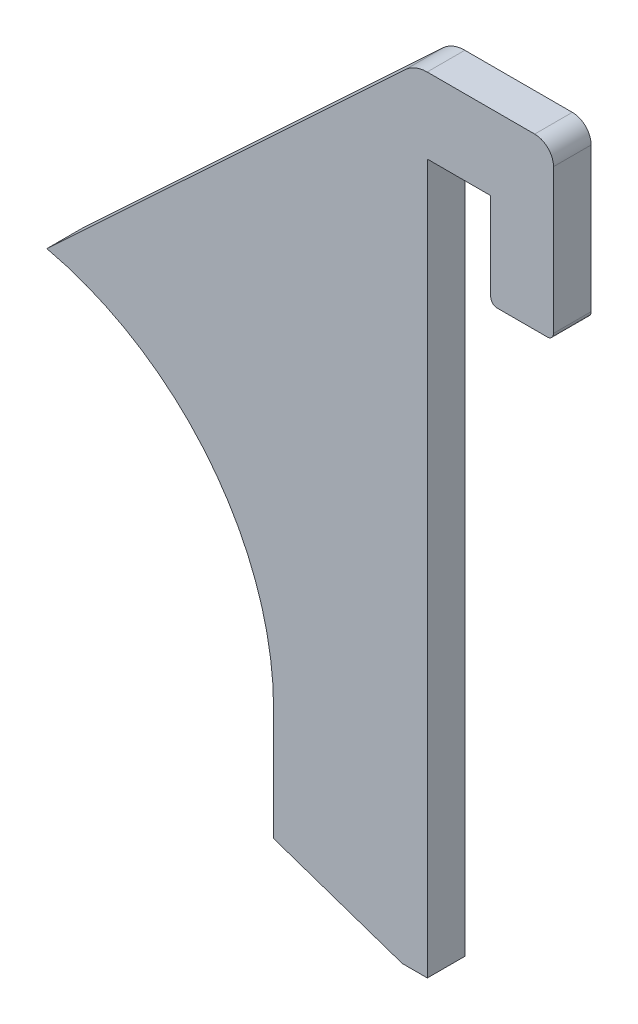
ISO-10303-21;
HEADER;
FILE_DESCRIPTION(('STEP AP214'),'2;1');
FILE_NAME('part.step','',(''),(''),'','','');
FILE_SCHEMA(('AUTOMOTIVE_DESIGN { 1 0 10303 214 1 1 1 1 }'));
ENDSEC;
DATA;
#1=APPLICATION_CONTEXT('core data for automotive mechanical design processes');
#2=APPLICATION_PROTOCOL_DEFINITION('international standard','automotive_design',2000,#1);
#3=PRODUCT_CONTEXT('',#1,'mechanical');
#4=PRODUCT('Part','Part','',(#3));
#5=PRODUCT_RELATED_PRODUCT_CATEGORY('part','',(#4));
#6=PRODUCT_DEFINITION_FORMATION('','',#4);
#7=PRODUCT_DEFINITION_CONTEXT('part definition',#1,'design');
#8=PRODUCT_DEFINITION('design','',#6,#7);
#9=PRODUCT_DEFINITION_SHAPE('','',#8);
#10=(LENGTH_UNIT() NAMED_UNIT(*) SI_UNIT(.MILLI.,.METRE.));
#11=(NAMED_UNIT(*) PLANE_ANGLE_UNIT() SI_UNIT($,.RADIAN.));
#12=(NAMED_UNIT(*) SI_UNIT($,.STERADIAN.) SOLID_ANGLE_UNIT());
#13=UNCERTAINTY_MEASURE_WITH_UNIT(LENGTH_MEASURE(1.E-05),#10,'distance_accuracy_value','');
#14=(GEOMETRIC_REPRESENTATION_CONTEXT(3) GLOBAL_UNCERTAINTY_ASSIGNED_CONTEXT((#13)) GLOBAL_UNIT_ASSIGNED_CONTEXT((#10,
#11,#12)) REPRESENTATION_CONTEXT('',''));
#15=CARTESIAN_POINT('',(0.,0.,0.));
#16=DIRECTION('',(0.,0.,1.));
#17=DIRECTION('',(1.,0.,0.));
#18=AXIS2_PLACEMENT_3D('',#15,#16,#17);
#19=CARTESIAN_POINT('',(69.,100.,6.));
#20=DIRECTION('',(0.681998360062503,-0.731353701619167,0.));
#21=DIRECTION('',(0.731353701619167,0.681998360062503,0.));
#22=AXIS2_PLACEMENT_3D('',#19,#20,#21);
#23=PLANE('',#22);
#24=DIRECTION('',(-0.731353701619167,-0.681998360062503,0.));
#25=VECTOR('',#24,1.);
#26=CARTESIAN_POINT('',(69.,100.,6.));
#27=LINE('',#26,#25);
#28=CARTESIAN_POINT('',(67.5595605777622,98.6567685080958,6.));
#29=VERTEX_POINT('',#28);
#30=CARTESIAN_POINT('',(10.3719829262458,45.3284896083872,6.));
#31=VERTEX_POINT('',#30);
#32=EDGE_CURVE('E143',#29,#31,#27,.T.);
#33=ORIENTED_EDGE('',*,*,#32,.F.);
#34=DIRECTION('',(0.,0.,-1.));
#35=VECTOR('',#34,1.);
#36=CARTESIAN_POINT('',(67.5595605777622,98.6567685080958,6.));
#37=LINE('',#36,#35);
#38=CARTESIAN_POINT('',(67.5595605777622,98.6567685080958,0.));
#39=VERTEX_POINT('',#38);
#40=EDGE_CURVE('E12',#29,#39,#37,.T.);
#41=ORIENTED_EDGE('',*,*,#40,.T.);
#42=DIRECTION('',(-0.731353701619167,-0.681998360062503,0.));
#43=VECTOR('',#42,1.);
#44=CARTESIAN_POINT('',(69.,100.,0.));
#45=LINE('',#44,#43);
#46=CARTESIAN_POINT('',(10.3719829262458,45.3284896083872,0.));
#47=VERTEX_POINT('',#46);
#48=EDGE_CURVE('E166',#39,#47,#45,.T.);
#49=ORIENTED_EDGE('',*,*,#48,.T.);
#50=DIRECTION('',(0.,0.,-1.));
#51=VECTOR('',#50,1.);
#52=CARTESIAN_POINT('',(10.3719829262458,45.3284896083872,6.));
#53=LINE('',#52,#51);
#54=EDGE_CURVE('E159',#31,#47,#53,.T.);
#55=ORIENTED_EDGE('',*,*,#54,.F.);
#56=EDGE_LOOP('',(#33,#41,#49,#55));
#57=FACE_BOUND('',#56,.T.);
#58=ADVANCED_FACE('F36',(#57),#23,.F.);
#59=CARTESIAN_POINT('',(0.,0.,6.));
#60=DIRECTION('',(0.,0.,-1.));
#61=DIRECTION('',(-1.,0.,0.));
#62=AXIS2_PLACEMENT_3D('',#59,#60,#61);
#63=CYLINDRICAL_SURFACE('',#62,46.5);
#64=CARTESIAN_POINT('',(0.,0.,0.));
#65=DIRECTION('',(0.,0.,-1.));
#66=DIRECTION('',(-1.,0.,0.));
#67=AXIS2_PLACEMENT_3D('',#64,#65,#66);
#68=CIRCLE('',#67,46.5);
#69=CARTESIAN_POINT('',(46.5,0.,0.));
#70=VERTEX_POINT('',#69);
#71=EDGE_CURVE('E245',#47,#70,#68,.T.);
#72=ORIENTED_EDGE('',*,*,#71,.T.);
#73=DIRECTION('',(0.,0.,-1.));
#74=VECTOR('',#73,1.);
#75=CARTESIAN_POINT('',(46.5,0.,6.));
#76=LINE('',#75,#74);
#77=CARTESIAN_POINT('',(46.5,0.,6.));
#78=VERTEX_POINT('',#77);
#79=EDGE_CURVE('E161',#78,#70,#76,.T.);
#80=ORIENTED_EDGE('',*,*,#79,.F.);
#81=CARTESIAN_POINT('',(0.,0.,6.));
#82=DIRECTION('',(0.,0.,-1.));
#83=DIRECTION('',(-1.,0.,0.));
#84=AXIS2_PLACEMENT_3D('',#81,#82,#83);
#85=CIRCLE('',#84,46.5);
#86=EDGE_CURVE('E147',#31,#78,#85,.T.);
#87=ORIENTED_EDGE('',*,*,#86,.F.);
#88=ORIENTED_EDGE('',*,*,#54,.T.);
#89=EDGE_LOOP('',(#72,#80,#87,#88));
#90=FACE_BOUND('',#89,.T.);
#91=ADVANCED_FACE('F158',(#90),#63,.F.);
#92=CARTESIAN_POINT('',(46.5,0.,6.));
#93=DIRECTION('',(1.,0.,0.));
#94=DIRECTION('',(0.,1.,0.));
#95=AXIS2_PLACEMENT_3D('',#92,#93,#94);
#96=PLANE('',#95);
#97=DIRECTION('',(0.,-1.,0.));
#98=VECTOR('',#97,1.);
#99=CARTESIAN_POINT('',(46.5,0.,0.));
#100=LINE('',#99,#98);
#101=CARTESIAN_POINT('',(46.5,-18.,0.));
#102=VERTEX_POINT('',#101);
#103=EDGE_CURVE('E239',#70,#102,#100,.T.);
#104=ORIENTED_EDGE('',*,*,#103,.T.);
#105=DIRECTION('',(0.,0.,-1.));
#106=VECTOR('',#105,1.);
#107=CARTESIAN_POINT('',(46.5,-18.,6.));
#108=LINE('',#107,#106);
#109=CARTESIAN_POINT('',(46.5,-18.,6.));
#110=VERTEX_POINT('',#109);
#111=EDGE_CURVE('E172',#110,#102,#108,.T.);
#112=ORIENTED_EDGE('',*,*,#111,.F.);
#113=DIRECTION('',(0.,-1.,0.));
#114=VECTOR('',#113,1.);
#115=CARTESIAN_POINT('',(46.5,0.,6.));
#116=LINE('',#115,#114);
#117=EDGE_CURVE('E163',#78,#110,#116,.T.);
#118=ORIENTED_EDGE('',*,*,#117,.F.);
#119=ORIENTED_EDGE('',*,*,#79,.T.);
#120=EDGE_LOOP('',(#104,#112,#118,#119));
#121=FACE_BOUND('',#120,.T.);
#122=ADVANCED_FACE('F277',(#121),#96,.F.);
#123=CARTESIAN_POINT('',(46.5,-18.,6.));
#124=DIRECTION('',(0.323143853291512,0.946349856067994,0.));
#125=DIRECTION('',(-0.946349856067995,0.323143853291512,0.));
#126=AXIS2_PLACEMENT_3D('',#123,#124,#125);
#127=PLANE('',#126);
#128=DIRECTION('',(0.946349856067994,-0.323143853291512,0.));
#129=VECTOR('',#128,1.);
#130=CARTESIAN_POINT('',(46.5,-18.,0.));
#131=LINE('',#130,#129);
#132=CARTESIAN_POINT('',(67.,-25.,0.));
#133=VERTEX_POINT('',#132);
#134=EDGE_CURVE('E234',#102,#133,#131,.T.);
#135=ORIENTED_EDGE('',*,*,#134,.T.);
#136=DIRECTION('',(0.,0.,-1.));
#137=VECTOR('',#136,1.);
#138=CARTESIAN_POINT('',(67.,-25.,6.));
#139=LINE('',#138,#137);
#140=CARTESIAN_POINT('',(67.,-25.,6.));
#141=VERTEX_POINT('',#140);
#142=EDGE_CURVE('E225',#141,#133,#139,.T.);
#143=ORIENTED_EDGE('',*,*,#142,.F.);
#144=DIRECTION('',(0.946349856067994,-0.323143853291512,0.));
#145=VECTOR('',#144,1.);
#146=CARTESIAN_POINT('',(46.5,-18.,6.));
#147=LINE('',#146,#145);
#148=EDGE_CURVE('E235',#110,#141,#147,.T.);
#149=ORIENTED_EDGE('',*,*,#148,.F.);
#150=ORIENTED_EDGE('',*,*,#111,.T.);
#151=EDGE_LOOP('',(#135,#143,#149,#150));
#152=FACE_BOUND('',#151,.T.);
#153=ADVANCED_FACE('F232',(#152),#127,.F.);
#154=CARTESIAN_POINT('',(67.,-25.,6.));
#155=DIRECTION('',(0.,1.,0.));
#156=DIRECTION('',(-1.,0.,0.));
#157=AXIS2_PLACEMENT_3D('',#154,#155,#156);
#158=PLANE('',#157);
#159=DIRECTION('',(1.,0.,0.));
#160=VECTOR('',#159,1.);
#161=CARTESIAN_POINT('',(67.,-25.,0.));
#162=LINE('',#161,#160);
#163=CARTESIAN_POINT('',(71.,-25.,0.));
#164=VERTEX_POINT('',#163);
#165=EDGE_CURVE('E241',#133,#164,#162,.T.);
#166=ORIENTED_EDGE('',*,*,#165,.T.);
#167=DIRECTION('',(0.,0.,-1.));
#168=VECTOR('',#167,1.);
#169=CARTESIAN_POINT('',(71.,-25.,6.));
#170=LINE('',#169,#168);
#171=CARTESIAN_POINT('',(71.,-25.,6.));
#172=VERTEX_POINT('',#171);
#173=EDGE_CURVE('E222',#172,#164,#170,.T.);
#174=ORIENTED_EDGE('',*,*,#173,.F.);
#175=DIRECTION('',(1.,0.,0.));
#176=VECTOR('',#175,1.);
#177=CARTESIAN_POINT('',(67.,-25.,6.));
#178=LINE('',#177,#176);
#179=EDGE_CURVE('E279',#141,#172,#178,.T.);
#180=ORIENTED_EDGE('',*,*,#179,.F.);
#181=ORIENTED_EDGE('',*,*,#142,.T.);
#182=EDGE_LOOP('',(#166,#174,#180,#181));
#183=FACE_BOUND('',#182,.T.);
#184=ADVANCED_FACE('F306',(#183),#158,.F.);
#185=CARTESIAN_POINT('',(71.,-25.,6.));
#186=DIRECTION('',(-1.,0.,0.));
#187=DIRECTION('',(0.,0.,1.));
#188=AXIS2_PLACEMENT_3D('',#185,#186,#187);
#189=PLANE('',#188);
#190=DIRECTION('',(0.,1.,0.));
#191=VECTOR('',#190,1.);
#192=CARTESIAN_POINT('',(71.,-25.,0.));
#193=LINE('',#192,#191);
#194=CARTESIAN_POINT('',(71.,88.,0.));
#195=VERTEX_POINT('',#194);
#196=EDGE_CURVE('E243',#164,#195,#193,.T.);
#197=ORIENTED_EDGE('',*,*,#196,.T.);
#198=DIRECTION('',(0.,0.,-1.));
#199=VECTOR('',#198,1.);
#200=CARTESIAN_POINT('',(71.,88.,6.));
#201=LINE('',#200,#199);
#202=CARTESIAN_POINT('',(71.,88.,6.));
#203=VERTEX_POINT('',#202);
#204=EDGE_CURVE('E219',#203,#195,#201,.T.);
#205=ORIENTED_EDGE('',*,*,#204,.F.);
#206=DIRECTION('',(0.,1.,0.));
#207=VECTOR('',#206,1.);
#208=CARTESIAN_POINT('',(71.,-25.,6.));
#209=LINE('',#208,#207);
#210=EDGE_CURVE('E283',#172,#203,#209,.T.);
#211=ORIENTED_EDGE('',*,*,#210,.F.);
#212=ORIENTED_EDGE('',*,*,#173,.T.);
#213=EDGE_LOOP('',(#197,#205,#211,#212));
#214=FACE_BOUND('',#213,.T.);
#215=ADVANCED_FACE('F301',(#214),#189,.F.);
#216=CARTESIAN_POINT('',(71.,88.,6.));
#217=DIRECTION('',(0.,1.,0.));
#218=DIRECTION('',(0.,0.,1.));
#219=AXIS2_PLACEMENT_3D('',#216,#217,#218);
#220=PLANE('',#219);
#221=DIRECTION('',(1.,0.,0.));
#222=VECTOR('',#221,1.);
#223=CARTESIAN_POINT('',(71.,88.,0.));
#224=LINE('',#223,#222);
#225=CARTESIAN_POINT('',(81.1,88.,0.));
#226=VERTEX_POINT('',#225);
#227=EDGE_CURVE('E250',#195,#226,#224,.T.);
#228=ORIENTED_EDGE('',*,*,#227,.T.);
#229=DIRECTION('',(0.,0.,-1.));
#230=VECTOR('',#229,1.);
#231=CARTESIAN_POINT('',(81.1,88.,6.));
#232=LINE('',#231,#230);
#233=CARTESIAN_POINT('',(81.1,88.,6.));
#234=VERTEX_POINT('',#233);
#235=EDGE_CURVE('E216',#234,#226,#232,.T.);
#236=ORIENTED_EDGE('',*,*,#235,.F.);
#237=DIRECTION('',(1.,0.,0.));
#238=VECTOR('',#237,1.);
#239=CARTESIAN_POINT('',(71.,88.,6.));
#240=LINE('',#239,#238);
#241=EDGE_CURVE('E285',#203,#234,#240,.T.);
#242=ORIENTED_EDGE('',*,*,#241,.F.);
#243=ORIENTED_EDGE('',*,*,#204,.T.);
#244=EDGE_LOOP('',(#228,#236,#242,#243));
#245=FACE_BOUND('',#244,.T.);
#246=ADVANCED_FACE('F298',(#245),#220,.F.);
#247=CARTESIAN_POINT('',(81.1,88.,6.));
#248=DIRECTION('',(1.,0.,0.));
#249=DIRECTION('',(0.,0.,-1.));
#250=AXIS2_PLACEMENT_3D('',#247,#248,#249);
#251=PLANE('',#250);
#252=DIRECTION('',(0.,-1.,0.));
#253=VECTOR('',#252,1.);
#254=CARTESIAN_POINT('',(81.1,88.,0.));
#255=LINE('',#254,#253);
#256=CARTESIAN_POINT('',(81.1,74.,0.));
#257=VERTEX_POINT('',#256);
#258=EDGE_CURVE('E252',#226,#257,#255,.T.);
#259=ORIENTED_EDGE('',*,*,#258,.T.);
#260=DIRECTION('',(0.,0.,-1.));
#261=VECTOR('',#260,1.);
#262=CARTESIAN_POINT('',(81.1,74.,6.));
#263=LINE('',#262,#261);
#264=CARTESIAN_POINT('',(81.1,74.,6.));
#265=VERTEX_POINT('',#264);
#266=EDGE_CURVE('E186',#257,#265,#263,.F.);
#267=ORIENTED_EDGE('',*,*,#266,.T.);
#268=DIRECTION('',(0.,-1.,0.));
#269=VECTOR('',#268,1.);
#270=CARTESIAN_POINT('',(81.1,88.,6.));
#271=LINE('',#270,#269);
#272=EDGE_CURVE('E273',#234,#265,#271,.T.);
#273=ORIENTED_EDGE('',*,*,#272,.F.);
#274=ORIENTED_EDGE('',*,*,#235,.T.);
#275=EDGE_LOOP('',(#259,#267,#273,#274));
#276=FACE_BOUND('',#275,.T.);
#277=ADVANCED_FACE('F296',(#276),#251,.F.);
#278=CARTESIAN_POINT('',(81.1,73.,6.));
#279=DIRECTION('',(0.,1.,0.));
#280=DIRECTION('',(-1.,0.,0.));
#281=AXIS2_PLACEMENT_3D('',#278,#279,#280);
#282=PLANE('',#281);
#283=DIRECTION('',(1.,0.,0.));
#284=VECTOR('',#283,1.);
#285=CARTESIAN_POINT('',(81.1,73.,6.));
#286=LINE('',#285,#284);
#287=CARTESIAN_POINT('',(82.1,73.,6.));
#288=VERTEX_POINT('',#287);
#289=CARTESIAN_POINT('',(90.1,73.,6.));
#290=VERTEX_POINT('',#289);
#291=EDGE_CURVE('E267',#288,#290,#286,.T.);
#292=ORIENTED_EDGE('',*,*,#291,.F.);
#293=DIRECTION('',(0.,0.,-1.));
#294=VECTOR('',#293,1.);
#295=CARTESIAN_POINT('',(82.1,73.,6.));
#296=LINE('',#295,#294);
#297=CARTESIAN_POINT('',(82.1,73.,0.));
#298=VERTEX_POINT('',#297);
#299=EDGE_CURVE('E170',#288,#298,#296,.T.);
#300=ORIENTED_EDGE('',*,*,#299,.T.);
#301=DIRECTION('',(1.,0.,0.));
#302=VECTOR('',#301,1.);
#303=CARTESIAN_POINT('',(81.1,73.,0.));
#304=LINE('',#303,#302);
#305=CARTESIAN_POINT('',(90.1,73.,0.));
#306=VERTEX_POINT('',#305);
#307=EDGE_CURVE('E212',#298,#306,#304,.T.);
#308=ORIENTED_EDGE('',*,*,#307,.T.);
#309=DIRECTION('',(0.,0.,-1.));
#310=VECTOR('',#309,1.);
#311=CARTESIAN_POINT('',(90.1,73.,6.));
#312=LINE('',#311,#310);
#313=EDGE_CURVE('E168',#306,#290,#312,.F.);
#314=ORIENTED_EDGE('',*,*,#313,.T.);
#315=EDGE_LOOP('',(#292,#300,#308,#314));
#316=FACE_BOUND('',#315,.T.);
#317=ADVANCED_FACE('F258',(#316),#282,.F.);
#318=CARTESIAN_POINT('',(91.1,73.,6.));
#319=DIRECTION('',(-1.,0.,0.));
#320=DIRECTION('',(0.,0.,1.));
#321=AXIS2_PLACEMENT_3D('',#318,#319,#320);
#322=PLANE('',#321);
#323=DIRECTION('',(0.,1.,0.));
#324=VECTOR('',#323,1.);
#325=CARTESIAN_POINT('',(91.1,73.,6.));
#326=LINE('',#325,#324);
#327=CARTESIAN_POINT('',(91.1,74.,6.));
#328=VERTEX_POINT('',#327);
#329=CARTESIAN_POINT('',(91.1,97.,6.));
#330=VERTEX_POINT('',#329);
#331=EDGE_CURVE('E266',#328,#330,#326,.T.);
#332=ORIENTED_EDGE('',*,*,#331,.F.);
#333=DIRECTION('',(0.,0.,-1.));
#334=VECTOR('',#333,1.);
#335=CARTESIAN_POINT('',(91.1,74.,6.));
#336=LINE('',#335,#334);
#337=CARTESIAN_POINT('',(91.1,74.,0.));
#338=VERTEX_POINT('',#337);
#339=EDGE_CURVE('E196',#328,#338,#336,.T.);
#340=ORIENTED_EDGE('',*,*,#339,.T.);
#341=DIRECTION('',(0.,1.,0.));
#342=VECTOR('',#341,1.);
#343=CARTESIAN_POINT('',(91.1,73.,0.));
#344=LINE('',#343,#342);
#345=CARTESIAN_POINT('',(91.1,97.,0.));
#346=VERTEX_POINT('',#345);
#347=EDGE_CURVE('E210',#338,#346,#344,.T.);
#348=ORIENTED_EDGE('',*,*,#347,.T.);
#349=DIRECTION('',(0.,0.,-1.));
#350=VECTOR('',#349,1.);
#351=CARTESIAN_POINT('',(91.1,97.,6.));
#352=LINE('',#351,#350);
#353=EDGE_CURVE('E194',#346,#330,#352,.F.);
#354=ORIENTED_EDGE('',*,*,#353,.T.);
#355=EDGE_LOOP('',(#332,#340,#348,#354));
#356=FACE_BOUND('',#355,.T.);
#357=ADVANCED_FACE('F269',(#356),#322,.F.);
#358=CARTESIAN_POINT('',(91.1,100.,6.));
#359=DIRECTION('',(0.,-1.,0.));
#360=DIRECTION('',(1.,0.,0.));
#361=AXIS2_PLACEMENT_3D('',#358,#359,#360);
#362=PLANE('',#361);
#363=DIRECTION('',(-1.,0.,0.));
#364=VECTOR('',#363,1.);
#365=CARTESIAN_POINT('',(91.1,100.,6.));
#366=LINE('',#365,#364);
#367=CARTESIAN_POINT('',(88.1,100.,6.));
#368=VERTEX_POINT('',#367);
#369=CARTESIAN_POINT('',(70.9695523780747,100.,6.));
#370=VERTEX_POINT('',#369);
#371=EDGE_CURVE('E203',#368,#370,#366,.T.);
#372=ORIENTED_EDGE('',*,*,#371,.F.);
#373=DIRECTION('',(0.,0.,-1.));
#374=VECTOR('',#373,1.);
#375=CARTESIAN_POINT('',(88.1,100.,6.));
#376=LINE('',#375,#374);
#377=CARTESIAN_POINT('',(88.1,100.,0.));
#378=VERTEX_POINT('',#377);
#379=EDGE_CURVE('E44',#368,#378,#376,.T.);
#380=ORIENTED_EDGE('',*,*,#379,.T.);
#381=DIRECTION('',(-1.,0.,0.));
#382=VECTOR('',#381,1.);
#383=CARTESIAN_POINT('',(91.1,100.,0.));
#384=LINE('',#383,#382);
#385=CARTESIAN_POINT('',(70.9695523780747,100.,0.));
#386=VERTEX_POINT('',#385);
#387=EDGE_CURVE('E154',#378,#386,#384,.T.);
#388=ORIENTED_EDGE('',*,*,#387,.T.);
#389=DIRECTION('',(0.,0.,-1.));
#390=VECTOR('',#389,1.);
#391=CARTESIAN_POINT('',(70.9695523780747,100.,6.));
#392=LINE('',#391,#390);
#393=EDGE_CURVE('E51',#386,#370,#392,.F.);
#394=ORIENTED_EDGE('',*,*,#393,.T.);
#395=EDGE_LOOP('',(#372,#380,#388,#394));
#396=FACE_BOUND('',#395,.T.);
#397=ADVANCED_FACE('F202',(#396),#362,.F.);
#398=CARTESIAN_POINT('',(0.,0.,6.));
#399=DIRECTION('',(0.,0.,-1.));
#400=DIRECTION('',(-1.,0.,0.));
#401=AXIS2_PLACEMENT_3D('',#398,#399,#400);
#402=PLANE('',#401);
#403=ORIENTED_EDGE('',*,*,#272,.T.);
#404=CARTESIAN_POINT('',(82.1,74.,6.));
#405=DIRECTION('',(0.,0.,-1.));
#406=DIRECTION('',(-1.,0.,0.));
#407=AXIS2_PLACEMENT_3D('',#404,#405,#406);
#408=CIRCLE('',#407,1.);
#409=EDGE_CURVE('E192',#265,#288,#408,.F.);
#410=ORIENTED_EDGE('',*,*,#409,.T.);
#411=ORIENTED_EDGE('',*,*,#291,.T.);
#412=CARTESIAN_POINT('',(90.1,74.,6.));
#413=DIRECTION('',(0.,0.,-1.));
#414=DIRECTION('',(-1.,0.,0.));
#415=AXIS2_PLACEMENT_3D('',#412,#413,#414);
#416=CIRCLE('',#415,1.);
#417=EDGE_CURVE('E190',#290,#328,#416,.F.);
#418=ORIENTED_EDGE('',*,*,#417,.T.);
#419=ORIENTED_EDGE('',*,*,#331,.T.);
#420=CARTESIAN_POINT('',(88.1,97.,6.));
#421=DIRECTION('',(0.,0.,-1.));
#422=DIRECTION('',(-1.,0.,0.));
#423=AXIS2_PLACEMENT_3D('',#420,#421,#422);
#424=CIRCLE('',#423,3.);
#425=EDGE_CURVE('E58',#330,#368,#424,.F.);
#426=ORIENTED_EDGE('',*,*,#425,.T.);
#427=ORIENTED_EDGE('',*,*,#371,.T.);
#428=CARTESIAN_POINT('',(70.9695523780747,95.,6.));
#429=DIRECTION('',(0.,0.,-1.));
#430=DIRECTION('',(-1.,0.,0.));
#431=AXIS2_PLACEMENT_3D('',#428,#429,#430);
#432=CIRCLE('',#431,5.);
#433=EDGE_CURVE('E150',#370,#29,#432,.F.);
#434=ORIENTED_EDGE('',*,*,#433,.T.);
#435=ORIENTED_EDGE('',*,*,#32,.T.);
#436=ORIENTED_EDGE('',*,*,#86,.T.);
#437=ORIENTED_EDGE('',*,*,#117,.T.);
#438=ORIENTED_EDGE('',*,*,#148,.T.);
#439=ORIENTED_EDGE('',*,*,#179,.T.);
#440=ORIENTED_EDGE('',*,*,#210,.T.);
#441=ORIENTED_EDGE('',*,*,#241,.T.);
#442=EDGE_LOOP('',(#403,#410,#411,#418,#419,#426,#427,#434,#435,#436,#437,#438,#439,#440,#441));
#443=FACE_BOUND('',#442,.T.);
#444=ADVANCED_FACE('F146',(#443),#402,.F.);
#445=CARTESIAN_POINT('',(0.,0.,0.));
#446=DIRECTION('',(0.,0.,-1.));
#447=DIRECTION('',(-1.,0.,0.));
#448=AXIS2_PLACEMENT_3D('',#445,#446,#447);
#449=PLANE('',#448);
#450=ORIENTED_EDGE('',*,*,#307,.F.);
#451=CARTESIAN_POINT('',(82.1,74.,0.));
#452=DIRECTION('',(0.,0.,-1.));
#453=DIRECTION('',(-1.,0.,0.));
#454=AXIS2_PLACEMENT_3D('',#451,#452,#453);
#455=CIRCLE('',#454,1.);
#456=EDGE_CURVE('E184',#298,#257,#455,.T.);
#457=ORIENTED_EDGE('',*,*,#456,.T.);
#458=ORIENTED_EDGE('',*,*,#258,.F.);
#459=ORIENTED_EDGE('',*,*,#227,.F.);
#460=ORIENTED_EDGE('',*,*,#196,.F.);
#461=ORIENTED_EDGE('',*,*,#165,.F.);
#462=ORIENTED_EDGE('',*,*,#134,.F.);
#463=ORIENTED_EDGE('',*,*,#103,.F.);
#464=ORIENTED_EDGE('',*,*,#71,.F.);
#465=ORIENTED_EDGE('',*,*,#48,.F.);
#466=CARTESIAN_POINT('',(70.9695523780747,95.,0.));
#467=DIRECTION('',(0.,0.,-1.));
#468=DIRECTION('',(-1.,0.,0.));
#469=AXIS2_PLACEMENT_3D('',#466,#467,#468);
#470=CIRCLE('',#469,5.);
#471=EDGE_CURVE('E178',#39,#386,#470,.T.);
#472=ORIENTED_EDGE('',*,*,#471,.T.);
#473=ORIENTED_EDGE('',*,*,#387,.F.);
#474=CARTESIAN_POINT('',(88.1,97.,0.));
#475=DIRECTION('',(0.,0.,-1.));
#476=DIRECTION('',(-1.,0.,0.));
#477=AXIS2_PLACEMENT_3D('',#474,#475,#476);
#478=CIRCLE('',#477,3.);
#479=EDGE_CURVE('E180',#378,#346,#478,.T.);
#480=ORIENTED_EDGE('',*,*,#479,.T.);
#481=ORIENTED_EDGE('',*,*,#347,.F.);
#482=CARTESIAN_POINT('',(90.1,74.,0.));
#483=DIRECTION('',(0.,0.,-1.));
#484=DIRECTION('',(-1.,0.,0.));
#485=AXIS2_PLACEMENT_3D('',#482,#483,#484);
#486=CIRCLE('',#485,1.);
#487=EDGE_CURVE('E182',#338,#306,#486,.T.);
#488=ORIENTED_EDGE('',*,*,#487,.T.);
#489=EDGE_LOOP('',(#450,#457,#458,#459,#460,#461,#462,#463,#464,#465,#472,#473,#480,#481,#488));
#490=FACE_BOUND('',#489,.T.);
#491=ADVANCED_FACE('F207',(#490),#449,.T.);
#492=CARTESIAN_POINT('',(82.1,74.,6.));
#493=DIRECTION('',(0.,0.,-1.));
#494=DIRECTION('',(-1.,0.,0.));
#495=AXIS2_PLACEMENT_3D('',#492,#493,#494);
#496=CYLINDRICAL_SURFACE('',#495,1.);
#497=ORIENTED_EDGE('',*,*,#409,.F.);
#498=ORIENTED_EDGE('',*,*,#266,.F.);
#499=ORIENTED_EDGE('',*,*,#456,.F.);
#500=ORIENTED_EDGE('',*,*,#299,.F.);
#501=EDGE_LOOP('',(#497,#498,#499,#500));
#502=FACE_BOUND('',#501,.T.);
#503=ADVANCED_FACE('F293',(#502),#496,.T.);
#504=CARTESIAN_POINT('',(90.1,74.,6.));
#505=DIRECTION('',(0.,0.,-1.));
#506=DIRECTION('',(-1.,0.,0.));
#507=AXIS2_PLACEMENT_3D('',#504,#505,#506);
#508=CYLINDRICAL_SURFACE('',#507,1.);
#509=ORIENTED_EDGE('',*,*,#417,.F.);
#510=ORIENTED_EDGE('',*,*,#313,.F.);
#511=ORIENTED_EDGE('',*,*,#487,.F.);
#512=ORIENTED_EDGE('',*,*,#339,.F.);
#513=EDGE_LOOP('',(#509,#510,#511,#512));
#514=FACE_BOUND('',#513,.T.);
#515=ADVANCED_FACE('F263',(#514),#508,.T.);
#516=CARTESIAN_POINT('',(88.1,97.,6.));
#517=DIRECTION('',(0.,0.,-1.));
#518=DIRECTION('',(-1.,0.,0.));
#519=AXIS2_PLACEMENT_3D('',#516,#517,#518);
#520=CYLINDRICAL_SURFACE('',#519,3.);
#521=ORIENTED_EDGE('',*,*,#425,.F.);
#522=ORIENTED_EDGE('',*,*,#353,.F.);
#523=ORIENTED_EDGE('',*,*,#479,.F.);
#524=ORIENTED_EDGE('',*,*,#379,.F.);
#525=EDGE_LOOP('',(#521,#522,#523,#524));
#526=FACE_BOUND('',#525,.T.);
#527=ADVANCED_FACE('F326',(#526),#520,.T.);
#528=CARTESIAN_POINT('',(70.9695523780747,95.,6.));
#529=DIRECTION('',(0.,0.,-1.));
#530=DIRECTION('',(-1.,0.,0.));
#531=AXIS2_PLACEMENT_3D('',#528,#529,#530);
#532=CYLINDRICAL_SURFACE('',#531,5.);
#533=ORIENTED_EDGE('',*,*,#433,.F.);
#534=ORIENTED_EDGE('',*,*,#393,.F.);
#535=ORIENTED_EDGE('',*,*,#471,.F.);
#536=ORIENTED_EDGE('',*,*,#40,.F.);
#537=EDGE_LOOP('',(#533,#534,#535,#536));
#538=FACE_BOUND('',#537,.T.);
#539=ADVANCED_FACE('F38',(#538),#532,.T.);
#540=CLOSED_SHELL('',(#58,#91,#122,#153,#184,#215,#246,#277,#317,#357,#397,#444,#491,#503,#515,
#527,#539));
#541=MANIFOLD_SOLID_BREP('B2',#540);
#542=ADVANCED_BREP_SHAPE_REPRESENTATION('',(#18,#541),#14);
#543=SHAPE_DEFINITION_REPRESENTATION(#9,#542);
ENDSEC;
END-ISO-10303-21;
